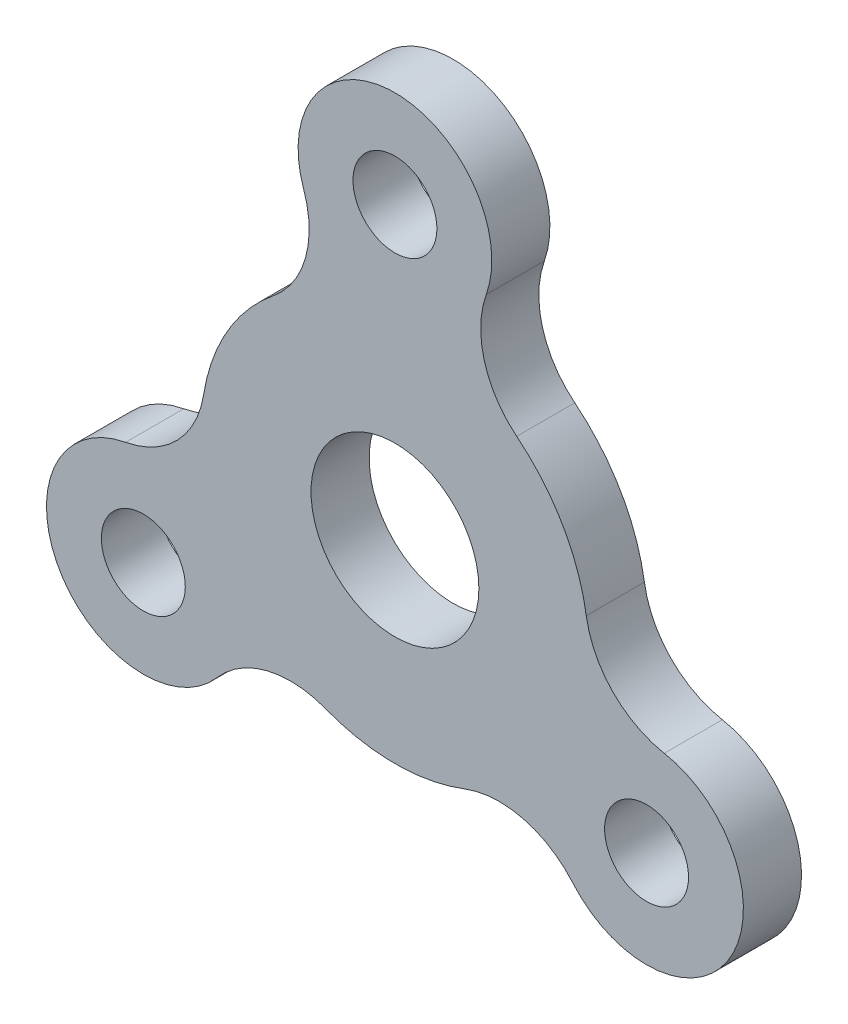
ISO-10303-21;
HEADER;
FILE_DESCRIPTION(('STEP AP214'),'2;1');
FILE_NAME('part.step','',(''),(''),'','','');
FILE_SCHEMA(('AUTOMOTIVE_DESIGN { 1 0 10303 214 1 1 1 1 }'));
ENDSEC;
DATA;
#1=APPLICATION_CONTEXT('core data for automotive mechanical design processes');
#2=APPLICATION_PROTOCOL_DEFINITION('international standard','automotive_design',2000,#1);
#3=PRODUCT_CONTEXT('',#1,'mechanical');
#4=PRODUCT('Part','Part','',(#3));
#5=PRODUCT_RELATED_PRODUCT_CATEGORY('part','',(#4));
#6=PRODUCT_DEFINITION_FORMATION('','',#4);
#7=PRODUCT_DEFINITION_CONTEXT('part definition',#1,'design');
#8=PRODUCT_DEFINITION('design','',#6,#7);
#9=PRODUCT_DEFINITION_SHAPE('','',#8);
#10=(LENGTH_UNIT() NAMED_UNIT(*) SI_UNIT(.MILLI.,.METRE.));
#11=(NAMED_UNIT(*) PLANE_ANGLE_UNIT() SI_UNIT($,.RADIAN.));
#12=(NAMED_UNIT(*) SI_UNIT($,.STERADIAN.) SOLID_ANGLE_UNIT());
#13=UNCERTAINTY_MEASURE_WITH_UNIT(LENGTH_MEASURE(1.E-05),#10,'distance_accuracy_value','');
#14=(GEOMETRIC_REPRESENTATION_CONTEXT(3) GLOBAL_UNCERTAINTY_ASSIGNED_CONTEXT((#13)) GLOBAL_UNIT_ASSIGNED_CONTEXT((#10,
#11,#12)) REPRESENTATION_CONTEXT('',''));
#15=CARTESIAN_POINT('',(0.,0.,0.));
#16=DIRECTION('',(0.,0.,1.));
#17=DIRECTION('',(1.,0.,0.));
#18=AXIS2_PLACEMENT_3D('',#15,#16,#17);
#19=CARTESIAN_POINT('',(-282.842712474619,350.,90.));
#20=DIRECTION('',(0.,0.,-1.));
#21=DIRECTION('',(-1.,0.,0.));
#22=AXIS2_PLACEMENT_3D('',#19,#20,#21);
#23=CYLINDRICAL_SURFACE('',#22,150.);
#24=CARTESIAN_POINT('',(-282.842712474619,350.,0.));
#25=DIRECTION('',(0.,0.,-1.));
#26=DIRECTION('',(1.,0.,0.));
#27=AXIS2_PLACEMENT_3D('',#24,#25,#26);
#28=CIRCLE('',#27,150.);
#29=CARTESIAN_POINT('',(-141.421356237309,400.,0.));
#30=VERTEX_POINT('',#29);
#31=CARTESIAN_POINT('',(-188.561808316413,233.333333333334,0.));
#32=VERTEX_POINT('',#31);
#33=EDGE_CURVE('E168',#30,#32,#28,.T.);
#34=ORIENTED_EDGE('',*,*,#33,.T.);
#35=DIRECTION('',(0.,0.,-1.));
#36=VECTOR('',#35,1.);
#37=CARTESIAN_POINT('',(-188.561808316413,233.333333333334,90.));
#38=LINE('',#37,#36);
#39=CARTESIAN_POINT('',(-188.561808316413,233.333333333334,90.));
#40=VERTEX_POINT('',#39);
#41=EDGE_CURVE('E11',#40,#32,#38,.T.);
#42=ORIENTED_EDGE('',*,*,#41,.F.);
#43=CARTESIAN_POINT('',(-282.842712474619,350.,90.));
#44=DIRECTION('',(0.,0.,-1.));
#45=DIRECTION('',(1.,0.,0.));
#46=AXIS2_PLACEMENT_3D('',#43,#44,#45);
#47=CIRCLE('',#46,150.);
#48=CARTESIAN_POINT('',(-141.421356237309,400.,90.));
#49=VERTEX_POINT('',#48);
#50=EDGE_CURVE('E203',#49,#40,#47,.T.);
#51=ORIENTED_EDGE('',*,*,#50,.F.);
#52=DIRECTION('',(0.,0.,-1.));
#53=VECTOR('',#52,1.);
#54=CARTESIAN_POINT('',(-141.421356237309,400.,90.));
#55=LINE('',#54,#53);
#56=EDGE_CURVE('E164',#49,#30,#55,.T.);
#57=ORIENTED_EDGE('',*,*,#56,.T.);
#58=EDGE_LOOP('',(#34,#42,#51,#57));
#59=FACE_BOUND('',#58,.T.);
#60=ADVANCED_FACE('F42',(#59),#23,.F.);
#61=CARTESIAN_POINT('',(0.,0.,90.));
#62=DIRECTION('',(0.,0.,-1.));
#63=DIRECTION('',(-1.,0.,0.));
#64=AXIS2_PLACEMENT_3D('',#61,#62,#63);
#65=CYLINDRICAL_SURFACE('',#64,300.);
#66=CARTESIAN_POINT('',(0.,0.,0.));
#67=DIRECTION('',(0.,0.,1.));
#68=DIRECTION('',(1.,0.,0.));
#69=AXIS2_PLACEMENT_3D('',#66,#67,#68);
#70=CIRCLE('',#69,300.);
#71=CARTESIAN_POINT('',(-296.353498374573,46.6326495188766,0.));
#72=VERTEX_POINT('',#71);
#73=EDGE_CURVE('E172',#32,#72,#70,.T.);
#74=ORIENTED_EDGE('',*,*,#73,.T.);
#75=DIRECTION('',(0.,0.,-1.));
#76=VECTOR('',#75,1.);
#77=CARTESIAN_POINT('',(-296.353498374573,46.6326495188766,90.));
#78=LINE('',#77,#76);
#79=CARTESIAN_POINT('',(-296.353498374573,46.6326495188766,90.));
#80=VERTEX_POINT('',#79);
#81=EDGE_CURVE('E51',#80,#72,#78,.T.);
#82=ORIENTED_EDGE('',*,*,#81,.F.);
#83=CARTESIAN_POINT('',(0.,0.,90.));
#84=DIRECTION('',(0.,0.,1.));
#85=DIRECTION('',(1.,0.,0.));
#86=AXIS2_PLACEMENT_3D('',#83,#84,#85);
#87=CIRCLE('',#86,300.);
#88=EDGE_CURVE('E114',#40,#80,#87,.T.);
#89=ORIENTED_EDGE('',*,*,#88,.F.);
#90=ORIENTED_EDGE('',*,*,#41,.T.);
#91=EDGE_LOOP('',(#74,#82,#89,#90));
#92=FACE_BOUND('',#91,.T.);
#93=ADVANCED_FACE('F305',(#92),#65,.T.);
#94=CARTESIAN_POINT('',(-444.530247561863,69.9489742783209,90.));
#95=DIRECTION('',(0.,0.,-1.));
#96=DIRECTION('',(-1.,0.,0.));
#97=AXIS2_PLACEMENT_3D('',#94,#95,#96);
#98=CYLINDRICAL_SURFACE('',#97,150.000000000003);
#99=CARTESIAN_POINT('',(-444.530247561863,69.9489742783209,0.));
#100=DIRECTION('',(0.,0.,-1.));
#101=DIRECTION('',(1.,0.,0.));
#102=AXIS2_PLACEMENT_3D('',#99,#100,#101);
#103=CIRCLE('',#102,150.000000000003);
#104=CARTESIAN_POINT('',(-417.12083963243,-77.5255128608432,0.));
#105=VERTEX_POINT('',#104);
#106=EDGE_CURVE('E176',#72,#105,#103,.T.);
#107=ORIENTED_EDGE('',*,*,#106,.T.);
#108=DIRECTION('',(0.,0.,-1.));
#109=VECTOR('',#108,1.);
#110=CARTESIAN_POINT('',(-417.12083963243,-77.5255128608432,90.));
#111=LINE('',#110,#109);
#112=CARTESIAN_POINT('',(-417.12083963243,-77.5255128608432,90.));
#113=VERTEX_POINT('',#112);
#114=EDGE_CURVE('E230',#113,#105,#111,.T.);
#115=ORIENTED_EDGE('',*,*,#114,.F.);
#116=CARTESIAN_POINT('',(-444.530247561863,69.9489742783209,90.));
#117=DIRECTION('',(0.,0.,-1.));
#118=DIRECTION('',(1.,0.,0.));
#119=AXIS2_PLACEMENT_3D('',#116,#117,#118);
#120=CIRCLE('',#119,150.000000000003);
#121=EDGE_CURVE('E241',#80,#113,#120,.T.);
#122=ORIENTED_EDGE('',*,*,#121,.F.);
#123=ORIENTED_EDGE('',*,*,#81,.T.);
#124=EDGE_LOOP('',(#107,#115,#122,#123));
#125=FACE_BOUND('',#124,.T.);
#126=ADVANCED_FACE('F239',(#125),#98,.F.);
#127=CARTESIAN_POINT('',(-389.711431702996,-225.000000000002,90.));
#128=DIRECTION('',(0.,0.,-1.));
#129=DIRECTION('',(-1.,0.,0.));
#130=AXIS2_PLACEMENT_3D('',#127,#128,#129);
#131=CYLINDRICAL_SURFACE('',#130,150.);
#132=CARTESIAN_POINT('',(-389.711431702996,-225.000000000002,0.));
#133=DIRECTION('',(0.,0.,1.));
#134=DIRECTION('',(1.,0.,0.));
#135=AXIS2_PLACEMENT_3D('',#132,#133,#134);
#136=CIRCLE('',#135,150.);
#137=CARTESIAN_POINT('',(-275.699483395119,-322.47448713916,0.));
#138=VERTEX_POINT('',#137);
#139=EDGE_CURVE('E179',#105,#138,#136,.T.);
#140=ORIENTED_EDGE('',*,*,#139,.T.);
#141=DIRECTION('',(0.,0.,-1.));
#142=VECTOR('',#141,1.);
#143=CARTESIAN_POINT('',(-275.699483395119,-322.47448713916,90.));
#144=LINE('',#143,#142);
#145=CARTESIAN_POINT('',(-275.699483395119,-322.47448713916,90.));
#146=VERTEX_POINT('',#145);
#147=EDGE_CURVE('E226',#146,#138,#144,.T.);
#148=ORIENTED_EDGE('',*,*,#147,.F.);
#149=CARTESIAN_POINT('',(-389.711431702996,-225.000000000002,90.));
#150=DIRECTION('',(0.,0.,1.));
#151=DIRECTION('',(1.,0.,0.));
#152=AXIS2_PLACEMENT_3D('',#149,#150,#151);
#153=CIRCLE('',#152,150.);
#154=EDGE_CURVE('E260',#113,#146,#153,.T.);
#155=ORIENTED_EDGE('',*,*,#154,.F.);
#156=ORIENTED_EDGE('',*,*,#114,.T.);
#157=EDGE_LOOP('',(#140,#148,#155,#156));
#158=FACE_BOUND('',#157,.T.);
#159=ADVANCED_FACE('F250',(#158),#131,.T.);
#160=CARTESIAN_POINT('',(-161.687535087242,-419.948974278319,90.));
#161=DIRECTION('',(0.,0.,-1.));
#162=DIRECTION('',(-1.,0.,0.));
#163=AXIS2_PLACEMENT_3D('',#160,#161,#162);
#164=CYLINDRICAL_SURFACE('',#163,150.);
#165=CARTESIAN_POINT('',(-161.687535087242,-419.948974278319,0.));
#166=DIRECTION('',(0.,0.,-1.));
#167=DIRECTION('',(1.,0.,0.));
#168=AXIS2_PLACEMENT_3D('',#165,#166,#167);
#169=CIRCLE('',#168,150.);
#170=CARTESIAN_POINT('',(-107.791690058161,-279.965982852212,0.));
#171=VERTEX_POINT('',#170);
#172=EDGE_CURVE('E182',#138,#171,#169,.T.);
#173=ORIENTED_EDGE('',*,*,#172,.T.);
#174=DIRECTION('',(0.,0.,-1.));
#175=VECTOR('',#174,1.);
#176=CARTESIAN_POINT('',(-107.791690058161,-279.965982852212,90.));
#177=LINE('',#176,#175);
#178=CARTESIAN_POINT('',(-107.791690058161,-279.965982852212,90.));
#179=VERTEX_POINT('',#178);
#180=EDGE_CURVE('E222',#179,#171,#177,.T.);
#181=ORIENTED_EDGE('',*,*,#180,.F.);
#182=CARTESIAN_POINT('',(-161.687535087242,-419.948974278319,90.));
#183=DIRECTION('',(0.,0.,-1.));
#184=DIRECTION('',(1.,0.,0.));
#185=AXIS2_PLACEMENT_3D('',#182,#183,#184);
#186=CIRCLE('',#185,150.);
#187=EDGE_CURVE('E256',#146,#179,#186,.T.);
#188=ORIENTED_EDGE('',*,*,#187,.F.);
#189=ORIENTED_EDGE('',*,*,#147,.T.);
#190=EDGE_LOOP('',(#173,#181,#188,#189));
#191=FACE_BOUND('',#190,.T.);
#192=ADVANCED_FACE('F254',(#191),#164,.F.);
#193=CARTESIAN_POINT('',(0.,0.,90.));
#194=DIRECTION('',(0.,0.,-1.));
#195=DIRECTION('',(-1.,0.,0.));
#196=AXIS2_PLACEMENT_3D('',#193,#194,#195);
#197=CYLINDRICAL_SURFACE('',#196,300.);
#198=CARTESIAN_POINT('',(0.,0.,0.));
#199=DIRECTION('',(0.,0.,1.));
#200=DIRECTION('',(1.,0.,0.));
#201=AXIS2_PLACEMENT_3D('',#198,#199,#200);
#202=CIRCLE('',#201,300.);
#203=CARTESIAN_POINT('',(107.791690058163,-279.965982852211,0.));
#204=VERTEX_POINT('',#203);
#205=EDGE_CURVE('E185',#171,#204,#202,.T.);
#206=ORIENTED_EDGE('',*,*,#205,.T.);
#207=DIRECTION('',(0.,0.,-1.));
#208=VECTOR('',#207,1.);
#209=CARTESIAN_POINT('',(107.791690058163,-279.965982852211,90.));
#210=LINE('',#209,#208);
#211=CARTESIAN_POINT('',(107.791690058163,-279.965982852211,90.));
#212=VERTEX_POINT('',#211);
#213=EDGE_CURVE('E218',#212,#204,#210,.T.);
#214=ORIENTED_EDGE('',*,*,#213,.F.);
#215=CARTESIAN_POINT('',(0.,0.,90.));
#216=DIRECTION('',(0.,0.,1.));
#217=DIRECTION('',(1.,0.,0.));
#218=AXIS2_PLACEMENT_3D('',#215,#216,#217);
#219=CIRCLE('',#218,300.);
#220=EDGE_CURVE('E259',#179,#212,#219,.T.);
#221=ORIENTED_EDGE('',*,*,#220,.F.);
#222=ORIENTED_EDGE('',*,*,#180,.T.);
#223=EDGE_LOOP('',(#206,#214,#221,#222));
#224=FACE_BOUND('',#223,.T.);
#225=ADVANCED_FACE('F318',(#224),#197,.T.);
#226=CARTESIAN_POINT('',(161.687535087245,-419.948974278317,90.));
#227=DIRECTION('',(0.,0.,-1.));
#228=DIRECTION('',(-1.,0.,0.));
#229=AXIS2_PLACEMENT_3D('',#226,#227,#228);
#230=CYLINDRICAL_SURFACE('',#229,150.);
#231=CARTESIAN_POINT('',(161.687535087245,-419.948974278317,0.));
#232=DIRECTION('',(0.,0.,-1.));
#233=DIRECTION('',(1.,0.,0.));
#234=AXIS2_PLACEMENT_3D('',#231,#232,#233);
#235=CIRCLE('',#234,150.);
#236=CARTESIAN_POINT('',(275.699483395122,-322.474487139158,0.));
#237=VERTEX_POINT('',#236);
#238=EDGE_CURVE('E188',#204,#237,#235,.T.);
#239=ORIENTED_EDGE('',*,*,#238,.T.);
#240=DIRECTION('',(0.,0.,-1.));
#241=VECTOR('',#240,1.);
#242=CARTESIAN_POINT('',(275.699483395122,-322.474487139158,90.));
#243=LINE('',#242,#241);
#244=CARTESIAN_POINT('',(275.699483395122,-322.474487139158,90.));
#245=VERTEX_POINT('',#244);
#246=EDGE_CURVE('E214',#245,#237,#243,.T.);
#247=ORIENTED_EDGE('',*,*,#246,.F.);
#248=CARTESIAN_POINT('',(161.687535087245,-419.948974278317,90.));
#249=DIRECTION('',(0.,0.,-1.));
#250=DIRECTION('',(1.,0.,0.));
#251=AXIS2_PLACEMENT_3D('',#248,#249,#250);
#252=CIRCLE('',#251,150.);
#253=EDGE_CURVE('E265',#212,#245,#252,.T.);
#254=ORIENTED_EDGE('',*,*,#253,.F.);
#255=ORIENTED_EDGE('',*,*,#213,.T.);
#256=EDGE_LOOP('',(#239,#247,#254,#255));
#257=FACE_BOUND('',#256,.T.);
#258=ADVANCED_FACE('F321',(#257),#230,.F.);
#259=CARTESIAN_POINT('',(389.711431702998,-224.999999999999,90.));
#260=DIRECTION('',(0.,0.,-1.));
#261=DIRECTION('',(-1.,0.,0.));
#262=AXIS2_PLACEMENT_3D('',#259,#260,#261);
#263=CYLINDRICAL_SURFACE('',#262,150.);
#264=CARTESIAN_POINT('',(389.711431702998,-224.999999999999,0.));
#265=DIRECTION('',(0.,0.,1.));
#266=DIRECTION('',(1.,0.,0.));
#267=AXIS2_PLACEMENT_3D('',#264,#265,#266);
#268=CIRCLE('',#267,150.);
#269=CARTESIAN_POINT('',(417.12083963243,-77.5255128608399,0.));
#270=VERTEX_POINT('',#269);
#271=EDGE_CURVE('E191',#237,#270,#268,.T.);
#272=ORIENTED_EDGE('',*,*,#271,.T.);
#273=DIRECTION('',(0.,0.,-1.));
#274=VECTOR('',#273,1.);
#275=CARTESIAN_POINT('',(417.12083963243,-77.5255128608399,90.));
#276=LINE('',#275,#274);
#277=CARTESIAN_POINT('',(417.12083963243,-77.5255128608399,90.));
#278=VERTEX_POINT('',#277);
#279=EDGE_CURVE('E210',#278,#270,#276,.T.);
#280=ORIENTED_EDGE('',*,*,#279,.F.);
#281=CARTESIAN_POINT('',(389.711431702998,-224.999999999999,90.));
#282=DIRECTION('',(0.,0.,1.));
#283=DIRECTION('',(1.,0.,0.));
#284=AXIS2_PLACEMENT_3D('',#281,#282,#283);
#285=CIRCLE('',#284,150.);
#286=EDGE_CURVE('E272',#245,#278,#285,.T.);
#287=ORIENTED_EDGE('',*,*,#286,.F.);
#288=ORIENTED_EDGE('',*,*,#246,.T.);
#289=EDGE_LOOP('',(#272,#280,#287,#288));
#290=FACE_BOUND('',#289,.T.);
#291=ADVANCED_FACE('F285',(#290),#263,.T.);
#292=CARTESIAN_POINT('',(444.530247561863,69.9489742783192,90.));
#293=DIRECTION('',(0.,0.,-1.));
#294=DIRECTION('',(-1.,0.,0.));
#295=AXIS2_PLACEMENT_3D('',#292,#293,#294);
#296=CYLINDRICAL_SURFACE('',#295,150.);
#297=CARTESIAN_POINT('',(444.530247561863,69.9489742783192,0.));
#298=DIRECTION('',(0.,0.,-1.));
#299=DIRECTION('',(1.,0.,0.));
#300=AXIS2_PLACEMENT_3D('',#297,#298,#299);
#301=CIRCLE('',#300,150.);
#302=CARTESIAN_POINT('',(296.353498374575,46.6326495188792,0.));
#303=VERTEX_POINT('',#302);
#304=EDGE_CURVE('E194',#270,#303,#301,.T.);
#305=ORIENTED_EDGE('',*,*,#304,.T.);
#306=DIRECTION('',(0.,0.,-1.));
#307=VECTOR('',#306,1.);
#308=CARTESIAN_POINT('',(296.353498374575,46.6326495188792,90.));
#309=LINE('',#308,#307);
#310=CARTESIAN_POINT('',(296.353498374575,46.6326495188792,90.));
#311=VERTEX_POINT('',#310);
#312=EDGE_CURVE('E156',#311,#303,#309,.T.);
#313=ORIENTED_EDGE('',*,*,#312,.F.);
#314=CARTESIAN_POINT('',(444.530247561863,69.9489742783192,90.));
#315=DIRECTION('',(0.,0.,-1.));
#316=DIRECTION('',(1.,0.,0.));
#317=AXIS2_PLACEMENT_3D('',#314,#315,#316);
#318=CIRCLE('',#317,150.);
#319=EDGE_CURVE('E145',#278,#311,#318,.T.);
#320=ORIENTED_EDGE('',*,*,#319,.F.);
#321=ORIENTED_EDGE('',*,*,#279,.T.);
#322=EDGE_LOOP('',(#305,#313,#320,#321));
#323=FACE_BOUND('',#322,.T.);
#324=ADVANCED_FACE('F289',(#323),#296,.F.);
#325=CARTESIAN_POINT('',(0.,0.,90.));
#326=DIRECTION('',(0.,0.,-1.));
#327=DIRECTION('',(-1.,0.,0.));
#328=AXIS2_PLACEMENT_3D('',#325,#326,#327);
#329=CYLINDRICAL_SURFACE('',#328,300.);
#330=CARTESIAN_POINT('',(0.,0.,0.));
#331=DIRECTION('',(0.,0.,1.));
#332=DIRECTION('',(1.,0.,0.));
#333=AXIS2_PLACEMENT_3D('',#330,#331,#332);
#334=CIRCLE('',#333,300.);
#335=CARTESIAN_POINT('',(188.561808316413,233.333333333334,0.));
#336=VERTEX_POINT('',#335);
#337=EDGE_CURVE('E154',#303,#336,#334,.T.);
#338=ORIENTED_EDGE('',*,*,#337,.T.);
#339=DIRECTION('',(0.,0.,-1.));
#340=VECTOR('',#339,1.);
#341=CARTESIAN_POINT('',(188.561808316413,233.333333333334,90.));
#342=LINE('',#341,#340);
#343=CARTESIAN_POINT('',(188.561808316413,233.333333333334,90.));
#344=VERTEX_POINT('',#343);
#345=EDGE_CURVE('E151',#344,#336,#342,.T.);
#346=ORIENTED_EDGE('',*,*,#345,.F.);
#347=CARTESIAN_POINT('',(0.,0.,90.));
#348=DIRECTION('',(0.,0.,1.));
#349=DIRECTION('',(1.,0.,0.));
#350=AXIS2_PLACEMENT_3D('',#347,#348,#349);
#351=CIRCLE('',#350,300.);
#352=EDGE_CURVE('E139',#311,#344,#351,.T.);
#353=ORIENTED_EDGE('',*,*,#352,.F.);
#354=ORIENTED_EDGE('',*,*,#312,.T.);
#355=EDGE_LOOP('',(#338,#346,#353,#354));
#356=FACE_BOUND('',#355,.T.);
#357=ADVANCED_FACE('F152',(#356),#329,.T.);
#358=CARTESIAN_POINT('',(282.842712474619,350.,90.));
#359=DIRECTION('',(0.,0.,-1.));
#360=DIRECTION('',(-1.,0.,0.));
#361=AXIS2_PLACEMENT_3D('',#358,#359,#360);
#362=CYLINDRICAL_SURFACE('',#361,150.);
#363=CARTESIAN_POINT('',(282.842712474619,350.,0.));
#364=DIRECTION('',(0.,0.,-1.));
#365=DIRECTION('',(1.,0.,0.));
#366=AXIS2_PLACEMENT_3D('',#363,#364,#365);
#367=CIRCLE('',#366,150.);
#368=CARTESIAN_POINT('',(141.421356237309,400.,0.));
#369=VERTEX_POINT('',#368);
#370=EDGE_CURVE('E100',#336,#369,#367,.T.);
#371=ORIENTED_EDGE('',*,*,#370,.T.);
#372=DIRECTION('',(0.,0.,-1.));
#373=VECTOR('',#372,1.);
#374=CARTESIAN_POINT('',(141.421356237309,400.,90.));
#375=LINE('',#374,#373);
#376=CARTESIAN_POINT('',(141.421356237309,400.,90.));
#377=VERTEX_POINT('',#376);
#378=EDGE_CURVE('E157',#377,#369,#375,.T.);
#379=ORIENTED_EDGE('',*,*,#378,.F.);
#380=CARTESIAN_POINT('',(282.842712474619,350.,90.));
#381=DIRECTION('',(0.,0.,-1.));
#382=DIRECTION('',(1.,0.,0.));
#383=AXIS2_PLACEMENT_3D('',#380,#381,#382);
#384=CIRCLE('',#383,150.);
#385=EDGE_CURVE('E143',#344,#377,#384,.T.);
#386=ORIENTED_EDGE('',*,*,#385,.F.);
#387=ORIENTED_EDGE('',*,*,#345,.T.);
#388=EDGE_LOOP('',(#371,#379,#386,#387));
#389=FACE_BOUND('',#388,.T.);
#390=ADVANCED_FACE('F159',(#389),#362,.F.);
#391=CARTESIAN_POINT('',(0.,450.,90.));
#392=DIRECTION('',(0.,0.,-1.));
#393=DIRECTION('',(-1.,0.,0.));
#394=AXIS2_PLACEMENT_3D('',#391,#392,#393);
#395=CYLINDRICAL_SURFACE('',#394,150.);
#396=CARTESIAN_POINT('',(0.,450.,0.));
#397=DIRECTION('',(0.,0.,1.));
#398=DIRECTION('',(1.,0.,0.));
#399=AXIS2_PLACEMENT_3D('',#396,#397,#398);
#400=CIRCLE('',#399,150.);
#401=EDGE_CURVE('E106',#369,#30,#400,.T.);
#402=ORIENTED_EDGE('',*,*,#401,.T.);
#403=ORIENTED_EDGE('',*,*,#56,.F.);
#404=CARTESIAN_POINT('',(0.,450.,90.));
#405=DIRECTION('',(0.,0.,1.));
#406=DIRECTION('',(1.,0.,0.));
#407=AXIS2_PLACEMENT_3D('',#404,#405,#406);
#408=CIRCLE('',#407,150.);
#409=EDGE_CURVE('E59',#377,#49,#408,.T.);
#410=ORIENTED_EDGE('',*,*,#409,.F.);
#411=ORIENTED_EDGE('',*,*,#378,.T.);
#412=EDGE_LOOP('',(#402,#403,#410,#411));
#413=FACE_BOUND('',#412,.T.);
#414=ADVANCED_FACE('F293',(#413),#395,.T.);
#415=CARTESIAN_POINT('',(-141.421356237309,400.,90.));
#416=DIRECTION('',(0.,0.,1.));
#417=DIRECTION('',(1.,0.,0.));
#418=AXIS2_PLACEMENT_3D('',#415,#416,#417);
#419=PLANE('',#418);
#420=CARTESIAN_POINT('',(0.,0.,90.));
#421=DIRECTION('',(0.,0.,1.));
#422=DIRECTION('',(1.,0.,0.));
#423=AXIS2_PLACEMENT_3D('',#420,#421,#422);
#424=CIRCLE('',#423,130.);
#425=CARTESIAN_POINT('',(130.,0.,90.));
#426=VERTEX_POINT('',#425);
#427=EDGE_CURVE('E493',#426,#426,#424,.T.);
#428=ORIENTED_EDGE('',*,*,#427,.F.);
#429=EDGE_LOOP('',(#428));
#430=FACE_BOUND('',#429,.T.);
#431=CARTESIAN_POINT('',(0.,450.,90.));
#432=DIRECTION('',(0.,0.,1.));
#433=DIRECTION('',(1.,0.,0.));
#434=AXIS2_PLACEMENT_3D('',#431,#432,#433);
#435=CIRCLE('',#434,65.);
#436=CARTESIAN_POINT('',(65.,450.,90.));
#437=VERTEX_POINT('',#436);
#438=EDGE_CURVE('E504',#437,#437,#435,.T.);
#439=ORIENTED_EDGE('',*,*,#438,.F.);
#440=EDGE_LOOP('',(#439));
#441=FACE_BOUND('',#440,.T.);
#442=CARTESIAN_POINT('',(-389.711431702996,-225.000000000002,90.));
#443=DIRECTION('',(0.,0.,1.));
#444=DIRECTION('',(1.,0.,0.));
#445=AXIS2_PLACEMENT_3D('',#442,#443,#444);
#446=CIRCLE('',#445,65.);
#447=CARTESIAN_POINT('',(-324.711431702996,-225.000000000002,90.));
#448=VERTEX_POINT('',#447);
#449=EDGE_CURVE('E512',#448,#448,#446,.T.);
#450=ORIENTED_EDGE('',*,*,#449,.F.);
#451=EDGE_LOOP('',(#450));
#452=FACE_BOUND('',#451,.T.);
#453=CARTESIAN_POINT('',(389.711431702998,-224.999999999999,90.));
#454=DIRECTION('',(0.,0.,1.));
#455=DIRECTION('',(1.,0.,0.));
#456=AXIS2_PLACEMENT_3D('',#453,#454,#455);
#457=CIRCLE('',#456,65.);
#458=CARTESIAN_POINT('',(454.711431702998,-224.999999999999,90.));
#459=VERTEX_POINT('',#458);
#460=EDGE_CURVE('E498',#459,#459,#457,.T.);
#461=ORIENTED_EDGE('',*,*,#460,.F.);
#462=EDGE_LOOP('',(#461));
#463=FACE_BOUND('',#462,.T.);
#464=ORIENTED_EDGE('',*,*,#50,.T.);
#465=ORIENTED_EDGE('',*,*,#88,.T.);
#466=ORIENTED_EDGE('',*,*,#121,.T.);
#467=ORIENTED_EDGE('',*,*,#154,.T.);
#468=ORIENTED_EDGE('',*,*,#187,.T.);
#469=ORIENTED_EDGE('',*,*,#220,.T.);
#470=ORIENTED_EDGE('',*,*,#253,.T.);
#471=ORIENTED_EDGE('',*,*,#286,.T.);
#472=ORIENTED_EDGE('',*,*,#319,.T.);
#473=ORIENTED_EDGE('',*,*,#352,.T.);
#474=ORIENTED_EDGE('',*,*,#385,.T.);
#475=ORIENTED_EDGE('',*,*,#409,.T.);
#476=EDGE_LOOP('',(#464,#465,#466,#467,#468,#469,#470,#471,#472,#473,#474,#475));
#477=FACE_BOUND('',#476,.T.);
#478=ADVANCED_FACE('F141',(#430,#441,#452,#463,#477),#419,.T.);
#479=CARTESIAN_POINT('',(-141.421356237309,400.,0.));
#480=DIRECTION('',(0.,0.,1.));
#481=DIRECTION('',(1.,0.,0.));
#482=AXIS2_PLACEMENT_3D('',#479,#480,#481);
#483=PLANE('',#482);
#484=CARTESIAN_POINT('',(0.,0.,0.));
#485=DIRECTION('',(0.,0.,1.));
#486=DIRECTION('',(1.,0.,0.));
#487=AXIS2_PLACEMENT_3D('',#484,#485,#486);
#488=CIRCLE('',#487,130.);
#489=CARTESIAN_POINT('',(130.,0.,0.));
#490=VERTEX_POINT('',#489);
#491=EDGE_CURVE('E490',#490,#490,#488,.T.);
#492=ORIENTED_EDGE('',*,*,#491,.T.);
#493=EDGE_LOOP('',(#492));
#494=FACE_BOUND('',#493,.T.);
#495=CARTESIAN_POINT('',(0.,450.,0.));
#496=DIRECTION('',(0.,0.,1.));
#497=DIRECTION('',(1.,0.,0.));
#498=AXIS2_PLACEMENT_3D('',#495,#496,#497);
#499=CIRCLE('',#498,65.);
#500=CARTESIAN_POINT('',(65.,450.,0.));
#501=VERTEX_POINT('',#500);
#502=EDGE_CURVE('E173',#501,#501,#499,.T.);
#503=ORIENTED_EDGE('',*,*,#502,.T.);
#504=EDGE_LOOP('',(#503));
#505=FACE_BOUND('',#504,.T.);
#506=CARTESIAN_POINT('',(-389.711431702996,-225.000000000002,0.));
#507=DIRECTION('',(0.,0.,1.));
#508=DIRECTION('',(1.,0.,0.));
#509=AXIS2_PLACEMENT_3D('',#506,#507,#508);
#510=CIRCLE('',#509,65.);
#511=CARTESIAN_POINT('',(-324.711431702996,-225.000000000002,0.));
#512=VERTEX_POINT('',#511);
#513=EDGE_CURVE('E508',#512,#512,#510,.T.);
#514=ORIENTED_EDGE('',*,*,#513,.T.);
#515=EDGE_LOOP('',(#514));
#516=FACE_BOUND('',#515,.T.);
#517=CARTESIAN_POINT('',(389.711431702998,-224.999999999999,0.));
#518=DIRECTION('',(0.,0.,1.));
#519=DIRECTION('',(1.,0.,0.));
#520=AXIS2_PLACEMENT_3D('',#517,#518,#519);
#521=CIRCLE('',#520,65.);
#522=CARTESIAN_POINT('',(454.711431702998,-224.999999999999,0.));
#523=VERTEX_POINT('',#522);
#524=EDGE_CURVE('E516',#523,#523,#521,.T.);
#525=ORIENTED_EDGE('',*,*,#524,.T.);
#526=EDGE_LOOP('',(#525));
#527=FACE_BOUND('',#526,.T.);
#528=ORIENTED_EDGE('',*,*,#33,.F.);
#529=ORIENTED_EDGE('',*,*,#401,.F.);
#530=ORIENTED_EDGE('',*,*,#370,.F.);
#531=ORIENTED_EDGE('',*,*,#337,.F.);
#532=ORIENTED_EDGE('',*,*,#304,.F.);
#533=ORIENTED_EDGE('',*,*,#271,.F.);
#534=ORIENTED_EDGE('',*,*,#238,.F.);
#535=ORIENTED_EDGE('',*,*,#205,.F.);
#536=ORIENTED_EDGE('',*,*,#172,.F.);
#537=ORIENTED_EDGE('',*,*,#139,.F.);
#538=ORIENTED_EDGE('',*,*,#106,.F.);
#539=ORIENTED_EDGE('',*,*,#73,.F.);
#540=EDGE_LOOP('',(#528,#529,#530,#531,#532,#533,#534,#535,#536,#537,#538,#539));
#541=FACE_BOUND('',#540,.T.);
#542=ADVANCED_FACE('F245',(#494,#505,#516,#527,#541),#483,.F.);
#543=CARTESIAN_POINT('',(389.711431702998,-224.999999999999,0.));
#544=DIRECTION('',(0.,0.,1.));
#545=DIRECTION('',(1.,0.,0.));
#546=AXIS2_PLACEMENT_3D('',#543,#544,#545);
#547=CYLINDRICAL_SURFACE('',#546,65.);
#548=CARTESIAN_POINT('',(454.711431702998,-224.999999999999,0.));
#549=CARTESIAN_POINT('',(454.711431702998,-224.999999999999,0.937499999999998));
#550=CARTESIAN_POINT('',(454.711431702998,-224.999999999999,1.875));
#551=CARTESIAN_POINT('',(454.711431702998,-224.999999999999,3.75));
#552=CARTESIAN_POINT('',(454.711431702998,-224.999999999999,4.6875));
#553=CARTESIAN_POINT('',(454.711431702998,-224.999999999999,6.5625));
#554=CARTESIAN_POINT('',(454.711431702998,-224.999999999999,7.5));
#555=CARTESIAN_POINT('',(454.711431702998,-224.999999999999,9.375));
#556=CARTESIAN_POINT('',(454.711431702998,-224.999999999999,10.3125));
#557=CARTESIAN_POINT('',(454.711431702998,-224.999999999999,12.1875));
#558=CARTESIAN_POINT('',(454.711431702998,-224.999999999999,13.125));
#559=CARTESIAN_POINT('',(454.711431702998,-224.999999999999,15.));
#560=CARTESIAN_POINT('',(454.711431702998,-224.999999999999,15.9375));
#561=CARTESIAN_POINT('',(454.711431702998,-224.999999999999,17.8125));
#562=CARTESIAN_POINT('',(454.711431702998,-224.999999999999,18.75));
#563=CARTESIAN_POINT('',(454.711431702998,-224.999999999999,20.625));
#564=CARTESIAN_POINT('',(454.711431702998,-224.999999999999,21.5625));
#565=CARTESIAN_POINT('',(454.711431702998,-224.999999999999,23.4375));
#566=CARTESIAN_POINT('',(454.711431702998,-224.999999999999,24.375));
#567=CARTESIAN_POINT('',(454.711431702998,-224.999999999999,26.25));
#568=CARTESIAN_POINT('',(454.711431702998,-224.999999999999,27.1875));
#569=CARTESIAN_POINT('',(454.711431702998,-224.999999999999,29.0625));
#570=CARTESIAN_POINT('',(454.711431702998,-224.999999999999,30.));
#571=CARTESIAN_POINT('',(454.711431702998,-224.999999999999,31.875));
#572=CARTESIAN_POINT('',(454.711431702998,-224.999999999999,32.8125));
#573=CARTESIAN_POINT('',(454.711431702998,-224.999999999999,34.6875));
#574=CARTESIAN_POINT('',(454.711431702998,-224.999999999999,35.625));
#575=CARTESIAN_POINT('',(454.711431702998,-224.999999999999,37.5));
#576=CARTESIAN_POINT('',(454.711431702998,-224.999999999999,38.4375));
#577=CARTESIAN_POINT('',(454.711431702998,-224.999999999999,40.3125));
#578=CARTESIAN_POINT('',(454.711431702998,-224.999999999999,41.25));
#579=CARTESIAN_POINT('',(454.711431702998,-224.999999999999,43.125));
#580=CARTESIAN_POINT('',(454.711431702998,-224.999999999999,44.0625));
#581=CARTESIAN_POINT('',(454.711431702998,-224.999999999999,45.9375));
#582=CARTESIAN_POINT('',(454.711431702998,-224.999999999999,46.875));
#583=CARTESIAN_POINT('',(454.711431702998,-224.999999999999,48.75));
#584=CARTESIAN_POINT('',(454.711431702998,-224.999999999999,49.6875));
#585=CARTESIAN_POINT('',(454.711431702998,-224.999999999999,51.5625));
#586=CARTESIAN_POINT('',(454.711431702998,-224.999999999999,52.5));
#587=CARTESIAN_POINT('',(454.711431702998,-224.999999999999,54.375));
#588=CARTESIAN_POINT('',(454.711431702998,-224.999999999999,55.3125));
#589=CARTESIAN_POINT('',(454.711431702998,-224.999999999999,57.1875));
#590=CARTESIAN_POINT('',(454.711431702998,-224.999999999999,58.125));
#591=CARTESIAN_POINT('',(454.711431702998,-224.999999999999,60.));
#592=CARTESIAN_POINT('',(454.711431702998,-224.999999999999,60.9375));
#593=CARTESIAN_POINT('',(454.711431702998,-224.999999999999,62.8125));
#594=CARTESIAN_POINT('',(454.711431702998,-224.999999999999,63.75));
#595=CARTESIAN_POINT('',(454.711431702998,-224.999999999999,65.625));
#596=CARTESIAN_POINT('',(454.711431702998,-224.999999999999,66.5625));
#597=CARTESIAN_POINT('',(454.711431702998,-224.999999999999,68.4375));
#598=CARTESIAN_POINT('',(454.711431702998,-224.999999999999,69.375));
#599=CARTESIAN_POINT('',(454.711431702998,-224.999999999999,71.25));
#600=CARTESIAN_POINT('',(454.711431702998,-224.999999999999,72.1875));
#601=CARTESIAN_POINT('',(454.711431702998,-224.999999999999,74.0625));
#602=CARTESIAN_POINT('',(454.711431702998,-224.999999999999,75.));
#603=CARTESIAN_POINT('',(454.711431702998,-224.999999999999,76.875));
#604=CARTESIAN_POINT('',(454.711431702998,-224.999999999999,77.8125));
#605=CARTESIAN_POINT('',(454.711431702998,-224.999999999999,79.6875));
#606=CARTESIAN_POINT('',(454.711431702998,-224.999999999999,80.625));
#607=CARTESIAN_POINT('',(454.711431702998,-224.999999999999,82.5));
#608=CARTESIAN_POINT('',(454.711431702998,-224.999999999999,83.4375));
#609=CARTESIAN_POINT('',(454.711431702998,-224.999999999999,85.3125));
#610=CARTESIAN_POINT('',(454.711431702998,-224.999999999999,86.25));
#611=CARTESIAN_POINT('',(454.711431702998,-224.999999999999,88.125));
#612=CARTESIAN_POINT('',(454.711431702998,-224.999999999999,89.0625));
#613=CARTESIAN_POINT('',(454.711431702998,-224.999999999999,90.));
#614=B_SPLINE_CURVE_WITH_KNOTS('',3,(#548,#549,#550,#551,#552,#553,#554,#555,#556,#557,#558,
#559,#560,#561,#562,#563,#564,#565,#566,#567,#568,#569,#570,#571,#572,#573,#574,#575,#576,#577,
#578,#579,#580,#581,#582,#583,#584,#585,#586,#587,#588,#589,#590,#591,#592,#593,#594,#595,#596,
#597,#598,#599,#600,#601,#602,#603,#604,#605,#606,#607,#608,#609,#610,#611,#612,#613),
.UNSPECIFIED.,.F.,.F.,(4,2,2,2,2,2,2,2,2,2,2,2,2,2,2,2,2,2,2,2,2,2,2,2,2,2,2,2,2,2,2,2,4),(0.,
2.8125,5.625,8.4375,11.25,14.0625,16.875,19.6875,22.5,25.3125,28.125,30.9375,33.75,36.5625,
39.375,42.1875,45.,47.8125,50.625,53.4375,56.25,59.0625,61.875,64.6875,67.5,70.3125,73.125,
75.9375,78.75,81.5625,84.375,87.1875,90.),.UNSPECIFIED.);
#615=EDGE_CURVE('BSEAM360',#523,#459,#614,.T.);
#616=ORIENTED_EDGE('',*,*,#524,.F.);
#617=ORIENTED_EDGE('',*,*,#460,.T.);
#618=ORIENTED_EDGE('',*,*,#615,.T.);
#619=ORIENTED_EDGE('',*,*,#615,.F.);
#620=EDGE_LOOP('',(#616,#618,#617,#619));
#621=FACE_BOUND('',#620,.T.);
#622=ADVANCED_FACE('F360',(#621),#547,.F.);
#623=CARTESIAN_POINT('',(-389.711431702996,-225.000000000002,0.));
#624=DIRECTION('',(0.,0.,1.));
#625=DIRECTION('',(1.,0.,0.));
#626=AXIS2_PLACEMENT_3D('',#623,#624,#625);
#627=CYLINDRICAL_SURFACE('',#626,65.);
#628=CARTESIAN_POINT('',(-324.711431702996,-225.000000000002,0.));
#629=CARTESIAN_POINT('',(-324.711431702996,-225.000000000002,0.937499999999998));
#630=CARTESIAN_POINT('',(-324.711431702996,-225.000000000002,1.875));
#631=CARTESIAN_POINT('',(-324.711431702996,-225.000000000002,3.75));
#632=CARTESIAN_POINT('',(-324.711431702996,-225.000000000002,4.6875));
#633=CARTESIAN_POINT('',(-324.711431702996,-225.000000000002,6.5625));
#634=CARTESIAN_POINT('',(-324.711431702996,-225.000000000002,7.5));
#635=CARTESIAN_POINT('',(-324.711431702996,-225.000000000002,9.375));
#636=CARTESIAN_POINT('',(-324.711431702996,-225.000000000002,10.3125));
#637=CARTESIAN_POINT('',(-324.711431702996,-225.000000000002,12.1875));
#638=CARTESIAN_POINT('',(-324.711431702996,-225.000000000002,13.125));
#639=CARTESIAN_POINT('',(-324.711431702996,-225.000000000002,15.));
#640=CARTESIAN_POINT('',(-324.711431702996,-225.000000000002,15.9375));
#641=CARTESIAN_POINT('',(-324.711431702996,-225.000000000002,17.8125));
#642=CARTESIAN_POINT('',(-324.711431702996,-225.000000000002,18.75));
#643=CARTESIAN_POINT('',(-324.711431702996,-225.000000000002,20.625));
#644=CARTESIAN_POINT('',(-324.711431702996,-225.000000000002,21.5625));
#645=CARTESIAN_POINT('',(-324.711431702996,-225.000000000002,23.4375));
#646=CARTESIAN_POINT('',(-324.711431702996,-225.000000000002,24.375));
#647=CARTESIAN_POINT('',(-324.711431702996,-225.000000000002,26.25));
#648=CARTESIAN_POINT('',(-324.711431702996,-225.000000000002,27.1875));
#649=CARTESIAN_POINT('',(-324.711431702996,-225.000000000002,29.0625));
#650=CARTESIAN_POINT('',(-324.711431702996,-225.000000000002,30.));
#651=CARTESIAN_POINT('',(-324.711431702996,-225.000000000002,31.875));
#652=CARTESIAN_POINT('',(-324.711431702996,-225.000000000002,32.8125));
#653=CARTESIAN_POINT('',(-324.711431702996,-225.000000000002,34.6875));
#654=CARTESIAN_POINT('',(-324.711431702996,-225.000000000002,35.625));
#655=CARTESIAN_POINT('',(-324.711431702996,-225.000000000002,37.5));
#656=CARTESIAN_POINT('',(-324.711431702996,-225.000000000002,38.4375));
#657=CARTESIAN_POINT('',(-324.711431702996,-225.000000000002,40.3125));
#658=CARTESIAN_POINT('',(-324.711431702996,-225.000000000002,41.25));
#659=CARTESIAN_POINT('',(-324.711431702996,-225.000000000002,43.125));
#660=CARTESIAN_POINT('',(-324.711431702996,-225.000000000002,44.0625));
#661=CARTESIAN_POINT('',(-324.711431702996,-225.000000000002,45.9375));
#662=CARTESIAN_POINT('',(-324.711431702996,-225.000000000002,46.875));
#663=CARTESIAN_POINT('',(-324.711431702996,-225.000000000002,48.75));
#664=CARTESIAN_POINT('',(-324.711431702996,-225.000000000002,49.6875));
#665=CARTESIAN_POINT('',(-324.711431702996,-225.000000000002,51.5625));
#666=CARTESIAN_POINT('',(-324.711431702996,-225.000000000002,52.5));
#667=CARTESIAN_POINT('',(-324.711431702996,-225.000000000002,54.375));
#668=CARTESIAN_POINT('',(-324.711431702996,-225.000000000002,55.3125));
#669=CARTESIAN_POINT('',(-324.711431702996,-225.000000000002,57.1875));
#670=CARTESIAN_POINT('',(-324.711431702996,-225.000000000002,58.125));
#671=CARTESIAN_POINT('',(-324.711431702996,-225.000000000002,60.));
#672=CARTESIAN_POINT('',(-324.711431702996,-225.000000000002,60.9375));
#673=CARTESIAN_POINT('',(-324.711431702996,-225.000000000002,62.8125));
#674=CARTESIAN_POINT('',(-324.711431702996,-225.000000000002,63.75));
#675=CARTESIAN_POINT('',(-324.711431702996,-225.000000000002,65.625));
#676=CARTESIAN_POINT('',(-324.711431702996,-225.000000000002,66.5625));
#677=CARTESIAN_POINT('',(-324.711431702996,-225.000000000002,68.4375));
#678=CARTESIAN_POINT('',(-324.711431702996,-225.000000000002,69.375));
#679=CARTESIAN_POINT('',(-324.711431702996,-225.000000000002,71.25));
#680=CARTESIAN_POINT('',(-324.711431702996,-225.000000000002,72.1875));
#681=CARTESIAN_POINT('',(-324.711431702996,-225.000000000002,74.0625));
#682=CARTESIAN_POINT('',(-324.711431702996,-225.000000000002,75.));
#683=CARTESIAN_POINT('',(-324.711431702996,-225.000000000002,76.875));
#684=CARTESIAN_POINT('',(-324.711431702996,-225.000000000002,77.8125));
#685=CARTESIAN_POINT('',(-324.711431702996,-225.000000000002,79.6875));
#686=CARTESIAN_POINT('',(-324.711431702996,-225.000000000002,80.625));
#687=CARTESIAN_POINT('',(-324.711431702996,-225.000000000002,82.5));
#688=CARTESIAN_POINT('',(-324.711431702996,-225.000000000002,83.4375));
#689=CARTESIAN_POINT('',(-324.711431702996,-225.000000000002,85.3125));
#690=CARTESIAN_POINT('',(-324.711431702996,-225.000000000002,86.25));
#691=CARTESIAN_POINT('',(-324.711431702996,-225.000000000002,88.125));
#692=CARTESIAN_POINT('',(-324.711431702996,-225.000000000002,89.0625));
#693=CARTESIAN_POINT('',(-324.711431702996,-225.000000000002,90.));
#694=B_SPLINE_CURVE_WITH_KNOTS('',3,(#628,#629,#630,#631,#632,#633,#634,#635,#636,#637,#638,
#639,#640,#641,#642,#643,#644,#645,#646,#647,#648,#649,#650,#651,#652,#653,#654,#655,#656,#657,
#658,#659,#660,#661,#662,#663,#664,#665,#666,#667,#668,#669,#670,#671,#672,#673,#674,#675,#676,
#677,#678,#679,#680,#681,#682,#683,#684,#685,#686,#687,#688,#689,#690,#691,#692,#693),
.UNSPECIFIED.,.F.,.F.,(4,2,2,2,2,2,2,2,2,2,2,2,2,2,2,2,2,2,2,2,2,2,2,2,2,2,2,2,2,2,2,2,4),(0.,
2.8125,5.625,8.4375,11.25,14.0625,16.875,19.6875,22.5,25.3125,28.125,30.9375,33.75,36.5625,
39.375,42.1875,45.,47.8125,50.625,53.4375,56.25,59.0625,61.875,64.6875,67.5,70.3125,73.125,
75.9375,78.75,81.5625,84.375,87.1875,90.),.UNSPECIFIED.);
#695=EDGE_CURVE('BSEAM369',#512,#448,#694,.T.);
#696=ORIENTED_EDGE('',*,*,#513,.F.);
#697=ORIENTED_EDGE('',*,*,#449,.T.);
#698=ORIENTED_EDGE('',*,*,#695,.T.);
#699=ORIENTED_EDGE('',*,*,#695,.F.);
#700=EDGE_LOOP('',(#696,#698,#697,#699));
#701=FACE_BOUND('',#700,.T.);
#702=ADVANCED_FACE('F369',(#701),#627,.F.);
#703=CARTESIAN_POINT('',(0.,450.,0.));
#704=DIRECTION('',(0.,0.,1.));
#705=DIRECTION('',(1.,0.,0.));
#706=AXIS2_PLACEMENT_3D('',#703,#704,#705);
#707=CYLINDRICAL_SURFACE('',#706,65.);
#708=CARTESIAN_POINT('',(65.,450.,0.));
#709=CARTESIAN_POINT('',(65.,450.,0.937499999999998));
#710=CARTESIAN_POINT('',(65.,450.,1.875));
#711=CARTESIAN_POINT('',(65.,450.,3.75));
#712=CARTESIAN_POINT('',(65.,450.,4.6875));
#713=CARTESIAN_POINT('',(65.,450.,6.5625));
#714=CARTESIAN_POINT('',(65.,450.,7.5));
#715=CARTESIAN_POINT('',(65.,450.,9.375));
#716=CARTESIAN_POINT('',(65.,450.,10.3125));
#717=CARTESIAN_POINT('',(65.,450.,12.1875));
#718=CARTESIAN_POINT('',(65.,450.,13.125));
#719=CARTESIAN_POINT('',(65.,450.,15.));
#720=CARTESIAN_POINT('',(65.,450.,15.9375));
#721=CARTESIAN_POINT('',(65.,450.,17.8125));
#722=CARTESIAN_POINT('',(65.,450.,18.75));
#723=CARTESIAN_POINT('',(65.,450.,20.625));
#724=CARTESIAN_POINT('',(65.,450.,21.5625));
#725=CARTESIAN_POINT('',(65.,450.,23.4375));
#726=CARTESIAN_POINT('',(65.,450.,24.375));
#727=CARTESIAN_POINT('',(65.,450.,26.25));
#728=CARTESIAN_POINT('',(65.,450.,27.1875));
#729=CARTESIAN_POINT('',(65.,450.,29.0625));
#730=CARTESIAN_POINT('',(65.,450.,30.));
#731=CARTESIAN_POINT('',(65.,450.,31.875));
#732=CARTESIAN_POINT('',(65.,450.,32.8125));
#733=CARTESIAN_POINT('',(65.,450.,34.6875));
#734=CARTESIAN_POINT('',(65.,450.,35.625));
#735=CARTESIAN_POINT('',(65.,450.,37.5));
#736=CARTESIAN_POINT('',(65.,450.,38.4375));
#737=CARTESIAN_POINT('',(65.,450.,40.3125));
#738=CARTESIAN_POINT('',(65.,450.,41.25));
#739=CARTESIAN_POINT('',(65.,450.,43.125));
#740=CARTESIAN_POINT('',(65.,450.,44.0625));
#741=CARTESIAN_POINT('',(65.,450.,45.9375));
#742=CARTESIAN_POINT('',(65.,450.,46.875));
#743=CARTESIAN_POINT('',(65.,450.,48.75));
#744=CARTESIAN_POINT('',(65.,450.,49.6875));
#745=CARTESIAN_POINT('',(65.,450.,51.5625));
#746=CARTESIAN_POINT('',(65.,450.,52.5));
#747=CARTESIAN_POINT('',(65.,450.,54.375));
#748=CARTESIAN_POINT('',(65.,450.,55.3125));
#749=CARTESIAN_POINT('',(65.,450.,57.1875));
#750=CARTESIAN_POINT('',(65.,450.,58.125));
#751=CARTESIAN_POINT('',(65.,450.,60.));
#752=CARTESIAN_POINT('',(65.,450.,60.9375));
#753=CARTESIAN_POINT('',(65.,450.,62.8125));
#754=CARTESIAN_POINT('',(65.,450.,63.75));
#755=CARTESIAN_POINT('',(65.,450.,65.625));
#756=CARTESIAN_POINT('',(65.,450.,66.5625));
#757=CARTESIAN_POINT('',(65.,450.,68.4375));
#758=CARTESIAN_POINT('',(65.,450.,69.375));
#759=CARTESIAN_POINT('',(65.,450.,71.25));
#760=CARTESIAN_POINT('',(65.,450.,72.1875));
#761=CARTESIAN_POINT('',(65.,450.,74.0625));
#762=CARTESIAN_POINT('',(65.,450.,75.));
#763=CARTESIAN_POINT('',(65.,450.,76.875));
#764=CARTESIAN_POINT('',(65.,450.,77.8125));
#765=CARTESIAN_POINT('',(65.,450.,79.6875));
#766=CARTESIAN_POINT('',(65.,450.,80.625));
#767=CARTESIAN_POINT('',(65.,450.,82.5));
#768=CARTESIAN_POINT('',(65.,450.,83.4375));
#769=CARTESIAN_POINT('',(65.,450.,85.3125));
#770=CARTESIAN_POINT('',(65.,450.,86.25));
#771=CARTESIAN_POINT('',(65.,450.,88.125));
#772=CARTESIAN_POINT('',(65.,450.,89.0625));
#773=CARTESIAN_POINT('',(65.,450.,90.));
#774=B_SPLINE_CURVE_WITH_KNOTS('',3,(#708,#709,#710,#711,#712,#713,#714,#715,#716,#717,#718,
#719,#720,#721,#722,#723,#724,#725,#726,#727,#728,#729,#730,#731,#732,#733,#734,#735,#736,#737,
#738,#739,#740,#741,#742,#743,#744,#745,#746,#747,#748,#749,#750,#751,#752,#753,#754,#755,#756,
#757,#758,#759,#760,#761,#762,#763,#764,#765,#766,#767,#768,#769,#770,#771,#772,#773),
.UNSPECIFIED.,.F.,.F.,(4,2,2,2,2,2,2,2,2,2,2,2,2,2,2,2,2,2,2,2,2,2,2,2,2,2,2,2,2,2,2,2,4),(0.,
2.8125,5.625,8.4375,11.25,14.0625,16.875,19.6875,22.5,25.3125,28.125,30.9375,33.75,36.5625,
39.375,42.1875,45.,47.8125,50.625,53.4375,56.25,59.0625,61.875,64.6875,67.5,70.3125,73.125,
75.9375,78.75,81.5625,84.375,87.1875,90.),.UNSPECIFIED.);
#775=EDGE_CURVE('BSEAM379',#501,#437,#774,.T.);
#776=ORIENTED_EDGE('',*,*,#502,.F.);
#777=ORIENTED_EDGE('',*,*,#438,.T.);
#778=ORIENTED_EDGE('',*,*,#775,.T.);
#779=ORIENTED_EDGE('',*,*,#775,.F.);
#780=EDGE_LOOP('',(#776,#778,#777,#779));
#781=FACE_BOUND('',#780,.T.);
#782=ADVANCED_FACE('F379',(#781),#707,.F.);
#783=CARTESIAN_POINT('',(0.,0.,0.));
#784=DIRECTION('',(0.,0.,1.));
#785=DIRECTION('',(1.,0.,0.));
#786=AXIS2_PLACEMENT_3D('',#783,#784,#785);
#787=CYLINDRICAL_SURFACE('',#786,130.);
#788=CARTESIAN_POINT('',(130.,0.,0.));
#789=CARTESIAN_POINT('',(130.,0.,0.937499999999998));
#790=CARTESIAN_POINT('',(130.,0.,1.875));
#791=CARTESIAN_POINT('',(130.,0.,3.75));
#792=CARTESIAN_POINT('',(130.,0.,4.6875));
#793=CARTESIAN_POINT('',(130.,0.,6.5625));
#794=CARTESIAN_POINT('',(130.,0.,7.5));
#795=CARTESIAN_POINT('',(130.,0.,9.375));
#796=CARTESIAN_POINT('',(130.,0.,10.3125));
#797=CARTESIAN_POINT('',(130.,0.,12.1875));
#798=CARTESIAN_POINT('',(130.,0.,13.125));
#799=CARTESIAN_POINT('',(130.,0.,15.));
#800=CARTESIAN_POINT('',(130.,0.,15.9375));
#801=CARTESIAN_POINT('',(130.,0.,17.8125));
#802=CARTESIAN_POINT('',(130.,0.,18.75));
#803=CARTESIAN_POINT('',(130.,0.,20.625));
#804=CARTESIAN_POINT('',(130.,0.,21.5625));
#805=CARTESIAN_POINT('',(130.,0.,23.4375));
#806=CARTESIAN_POINT('',(130.,0.,24.375));
#807=CARTESIAN_POINT('',(130.,0.,26.25));
#808=CARTESIAN_POINT('',(130.,0.,27.1875));
#809=CARTESIAN_POINT('',(130.,0.,29.0625));
#810=CARTESIAN_POINT('',(130.,0.,30.));
#811=CARTESIAN_POINT('',(130.,0.,31.875));
#812=CARTESIAN_POINT('',(130.,0.,32.8125));
#813=CARTESIAN_POINT('',(130.,0.,34.6875));
#814=CARTESIAN_POINT('',(130.,0.,35.625));
#815=CARTESIAN_POINT('',(130.,0.,37.5));
#816=CARTESIAN_POINT('',(130.,0.,38.4375));
#817=CARTESIAN_POINT('',(130.,0.,40.3125));
#818=CARTESIAN_POINT('',(130.,0.,41.25));
#819=CARTESIAN_POINT('',(130.,0.,43.125));
#820=CARTESIAN_POINT('',(130.,0.,44.0625));
#821=CARTESIAN_POINT('',(130.,0.,45.9375));
#822=CARTESIAN_POINT('',(130.,0.,46.875));
#823=CARTESIAN_POINT('',(130.,0.,48.75));
#824=CARTESIAN_POINT('',(130.,0.,49.6875));
#825=CARTESIAN_POINT('',(130.,0.,51.5625));
#826=CARTESIAN_POINT('',(130.,0.,52.5));
#827=CARTESIAN_POINT('',(130.,0.,54.375));
#828=CARTESIAN_POINT('',(130.,0.,55.3125));
#829=CARTESIAN_POINT('',(130.,0.,57.1875));
#830=CARTESIAN_POINT('',(130.,0.,58.125));
#831=CARTESIAN_POINT('',(130.,0.,60.));
#832=CARTESIAN_POINT('',(130.,0.,60.9375));
#833=CARTESIAN_POINT('',(130.,0.,62.8125));
#834=CARTESIAN_POINT('',(130.,0.,63.75));
#835=CARTESIAN_POINT('',(130.,0.,65.625));
#836=CARTESIAN_POINT('',(130.,0.,66.5625));
#837=CARTESIAN_POINT('',(130.,0.,68.4375));
#838=CARTESIAN_POINT('',(130.,0.,69.375));
#839=CARTESIAN_POINT('',(130.,0.,71.25));
#840=CARTESIAN_POINT('',(130.,0.,72.1875));
#841=CARTESIAN_POINT('',(130.,0.,74.0625));
#842=CARTESIAN_POINT('',(130.,0.,75.));
#843=CARTESIAN_POINT('',(130.,0.,76.875));
#844=CARTESIAN_POINT('',(130.,0.,77.8125));
#845=CARTESIAN_POINT('',(130.,0.,79.6875));
#846=CARTESIAN_POINT('',(130.,0.,80.625));
#847=CARTESIAN_POINT('',(130.,0.,82.5));
#848=CARTESIAN_POINT('',(130.,0.,83.4375));
#849=CARTESIAN_POINT('',(130.,0.,85.3125));
#850=CARTESIAN_POINT('',(130.,0.,86.25));
#851=CARTESIAN_POINT('',(130.,0.,88.125));
#852=CARTESIAN_POINT('',(130.,0.,89.0625));
#853=CARTESIAN_POINT('',(130.,0.,90.));
#854=B_SPLINE_CURVE_WITH_KNOTS('',3,(#788,#789,#790,#791,#792,#793,#794,#795,#796,#797,#798,
#799,#800,#801,#802,#803,#804,#805,#806,#807,#808,#809,#810,#811,#812,#813,#814,#815,#816,#817,
#818,#819,#820,#821,#822,#823,#824,#825,#826,#827,#828,#829,#830,#831,#832,#833,#834,#835,#836,
#837,#838,#839,#840,#841,#842,#843,#844,#845,#846,#847,#848,#849,#850,#851,#852,#853),
.UNSPECIFIED.,.F.,.F.,(4,2,2,2,2,2,2,2,2,2,2,2,2,2,2,2,2,2,2,2,2,2,2,2,2,2,2,2,2,2,2,2,4),(0.,
2.8125,5.625,8.4375,11.25,14.0625,16.875,19.6875,22.5,25.3125,28.125,30.9375,33.75,36.5625,
39.375,42.1875,45.,47.8125,50.625,53.4375,56.25,59.0625,61.875,64.6875,67.5,70.3125,73.125,
75.9375,78.75,81.5625,84.375,87.1875,90.),.UNSPECIFIED.);
#855=EDGE_CURVE('BSEAM388',#490,#426,#854,.T.);
#856=ORIENTED_EDGE('',*,*,#491,.F.);
#857=ORIENTED_EDGE('',*,*,#427,.T.);
#858=ORIENTED_EDGE('',*,*,#855,.T.);
#859=ORIENTED_EDGE('',*,*,#855,.F.);
#860=EDGE_LOOP('',(#856,#858,#857,#859));
#861=FACE_BOUND('',#860,.T.);
#862=ADVANCED_FACE('F388',(#861),#787,.F.);
#863=CLOSED_SHELL('',(#60,#93,#126,#159,#192,#225,#258,#291,#324,#357,#390,#414,#478,#542,#622,
#702,#782,#862));
#864=MANIFOLD_SOLID_BREP('B2',#863);
#865=ADVANCED_BREP_SHAPE_REPRESENTATION('',(#18,#864),#14);
#866=SHAPE_DEFINITION_REPRESENTATION(#9,#865);
ENDSEC;
END-ISO-10303-21;
